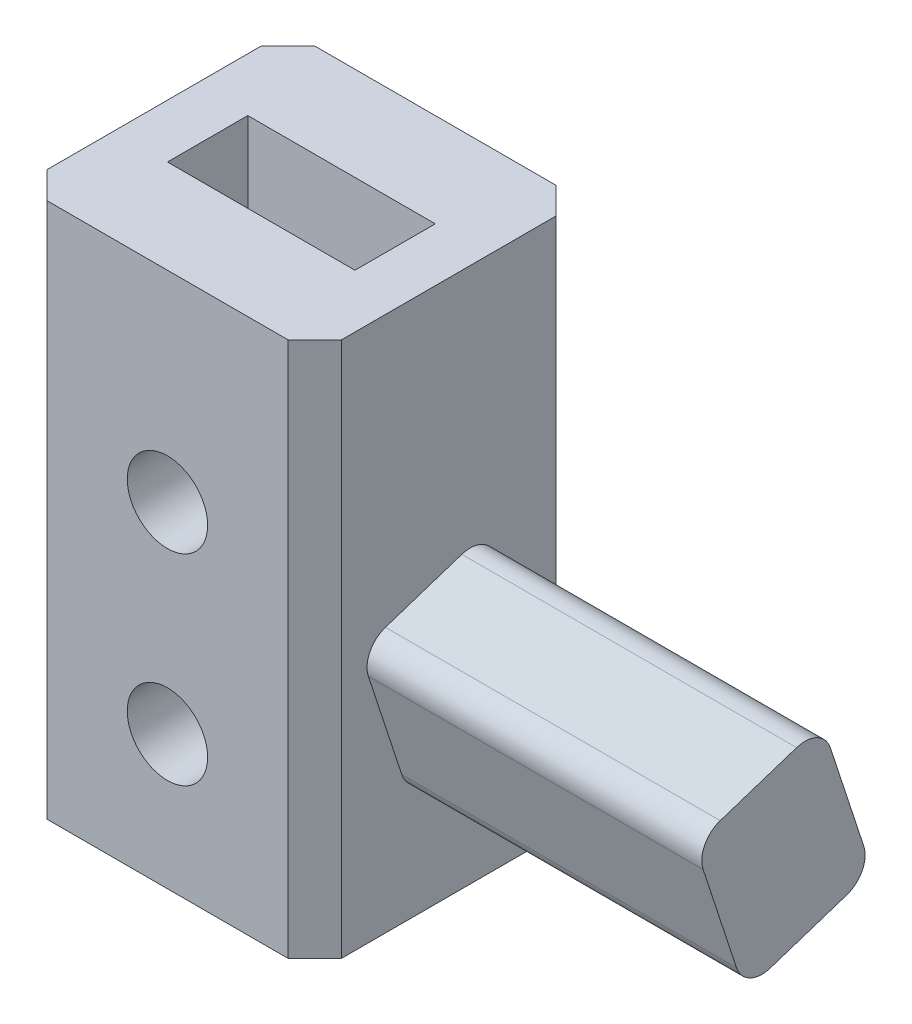
ISO-10303-21;
HEADER;
FILE_DESCRIPTION(('STEP AP214'),'2;1');
FILE_NAME('part.step','',(''),(''),'','','');
FILE_SCHEMA(('AUTOMOTIVE_DESIGN { 1 0 10303 214 1 1 1 1 }'));
ENDSEC;
DATA;
#1=APPLICATION_CONTEXT('core data for automotive mechanical design processes');
#2=APPLICATION_PROTOCOL_DEFINITION('international standard','automotive_design',2000,#1);
#3=PRODUCT_CONTEXT('',#1,'mechanical');
#4=PRODUCT('Part','Part','',(#3));
#5=PRODUCT_RELATED_PRODUCT_CATEGORY('part','',(#4));
#6=PRODUCT_DEFINITION_FORMATION('','',#4);
#7=PRODUCT_DEFINITION_CONTEXT('part definition',#1,'design');
#8=PRODUCT_DEFINITION('design','',#6,#7);
#9=PRODUCT_DEFINITION_SHAPE('','',#8);
#10=(LENGTH_UNIT() NAMED_UNIT(*) SI_UNIT(.MILLI.,.METRE.));
#11=(NAMED_UNIT(*) PLANE_ANGLE_UNIT() SI_UNIT($,.RADIAN.));
#12=(NAMED_UNIT(*) SI_UNIT($,.STERADIAN.) SOLID_ANGLE_UNIT());
#13=UNCERTAINTY_MEASURE_WITH_UNIT(LENGTH_MEASURE(1.E-05),#10,'distance_accuracy_value','');
#14=(GEOMETRIC_REPRESENTATION_CONTEXT(3) GLOBAL_UNCERTAINTY_ASSIGNED_CONTEXT((#13)) GLOBAL_UNIT_ASSIGNED_CONTEXT((#10,
#11,#12)) REPRESENTATION_CONTEXT('',''));
#15=CARTESIAN_POINT('',(0.,0.,0.));
#16=DIRECTION('',(0.,0.,1.));
#17=DIRECTION('',(1.,0.,0.));
#18=AXIS2_PLACEMENT_3D('',#15,#16,#17);
#19=CARTESIAN_POINT('',(11.,40.,7.99999999999999));
#20=DIRECTION('',(-1.,0.,0.));
#21=DIRECTION('',(0.,0.,1.));
#22=AXIS2_PLACEMENT_3D('',#19,#20,#21);
#23=PLANE('',#22);
#24=DIRECTION('',(0.,0.,-1.));
#25=VECTOR('',#24,1.);
#26=CARTESIAN_POINT('',(11.,0.,7.99999999999999));
#27=LINE('',#26,#25);
#28=CARTESIAN_POINT('',(11.,0.,7.99999999999999));
#29=VERTEX_POINT('',#28);
#30=CARTESIAN_POINT('',(11.,0.,-8.00000000000001));
#31=VERTEX_POINT('',#30);
#32=EDGE_CURVE('E255',#29,#31,#27,.T.);
#33=ORIENTED_EDGE('',*,*,#32,.T.);
#34=DIRECTION('',(0.,-1.,0.));
#35=VECTOR('',#34,1.);
#36=CARTESIAN_POINT('',(11.,40.,-8.00000000000001));
#37=LINE('',#36,#35);
#38=CARTESIAN_POINT('',(11.,40.,-8.00000000000001));
#39=VERTEX_POINT('',#38);
#40=EDGE_CURVE('E270',#39,#31,#37,.T.);
#41=ORIENTED_EDGE('',*,*,#40,.F.);
#42=DIRECTION('',(0.,0.,-1.));
#43=VECTOR('',#42,1.);
#44=CARTESIAN_POINT('',(11.,40.,7.99999999999999));
#45=LINE('',#44,#43);
#46=CARTESIAN_POINT('',(11.,40.,7.99999999999999));
#47=VERTEX_POINT('',#46);
#48=EDGE_CURVE('E238',#47,#39,#45,.T.);
#49=ORIENTED_EDGE('',*,*,#48,.F.);
#50=DIRECTION('',(0.,-1.,0.));
#51=VECTOR('',#50,1.);
#52=CARTESIAN_POINT('',(11.,40.,7.99999999999999));
#53=LINE('',#52,#51);
#54=EDGE_CURVE('E273',#47,#29,#53,.T.);
#55=ORIENTED_EDGE('',*,*,#54,.T.);
#56=EDGE_LOOP('',(#33,#41,#49,#55));
#57=FACE_BOUND('',#56,.T.);
#58=CARTESIAN_POINT('',(11.,17.8663977427574,4.0967992360275));
#59=DIRECTION('',(1.,0.,0.));
#60=DIRECTION('',(0.,0.,-1.));
#61=AXIS2_PLACEMENT_3D('',#58,#59,#60);
#62=CIRCLE('',#61,2.);
#63=CARTESIAN_POINT('',(11.,19.7668768370863,4.71983953329452));
#64=VERTEX_POINT('',#63);
#65=CARTESIAN_POINT('',(11.,17.2433574454903,5.99727833035645));
#66=VERTEX_POINT('',#65);
#67=EDGE_CURVE('E190',#64,#66,#62,.T.);
#68=ORIENTED_EDGE('',*,*,#67,.F.);
#69=DIRECTION('',(0.,-0.311520148633516,0.950239547164478));
#70=VECTOR('',#69,1.);
#71=CARTESIAN_POINT('',(11.,19.7668768370863,4.71983953329452));
#72=LINE('',#71,#70);
#73=CARTESIAN_POINT('',(11.,21.6359977288874,-0.981597749692318));
#74=VERTEX_POINT('',#73);
#75=EDGE_CURVE('E187',#74,#64,#72,.T.);
#76=ORIENTED_EDGE('',*,*,#75,.F.);
#77=CARTESIAN_POINT('',(11.,19.7355186345585,-1.60463804695936));
#78=DIRECTION('',(1.,0.,0.));
#79=DIRECTION('',(0.,0.,-1.));
#80=AXIS2_PLACEMENT_3D('',#77,#78,#79);
#81=CIRCLE('',#80,2.);
#82=CARTESIAN_POINT('',(11.,20.3585589318255,-3.50511714128832));
#83=VERTEX_POINT('',#82);
#84=EDGE_CURVE('E449',#83,#74,#81,.T.);
#85=ORIENTED_EDGE('',*,*,#84,.F.);
#86=DIRECTION('',(0.,0.950239547164478,0.311520148633517));
#87=VECTOR('',#86,1.);
#88=CARTESIAN_POINT('',(11.,12.7566425545097,-5.99727833035645));
#89=LINE('',#88,#87);
#90=CARTESIAN_POINT('',(11.,12.7566425545097,-5.99727833035646));
#91=VERTEX_POINT('',#90);
#92=EDGE_CURVE('E446',#91,#83,#89,.T.);
#93=ORIENTED_EDGE('',*,*,#92,.F.);
#94=CARTESIAN_POINT('',(11.,12.1336022572426,-4.0967992360275));
#95=DIRECTION('',(1.,0.,0.));
#96=DIRECTION('',(0.,0.,-1.));
#97=AXIS2_PLACEMENT_3D('',#94,#95,#96);
#98=CIRCLE('',#97,2.);
#99=CARTESIAN_POINT('',(11.,10.2331231629137,-4.71983953329452));
#100=VERTEX_POINT('',#99);
#101=EDGE_CURVE('E443',#100,#91,#98,.T.);
#102=ORIENTED_EDGE('',*,*,#101,.F.);
#103=DIRECTION('',(0.,0.311520148633517,-0.950239547164478));
#104=VECTOR('',#103,1.);
#105=CARTESIAN_POINT('',(11.,8.36400227111258,0.98159774969232));
#106=LINE('',#105,#104);
#107=CARTESIAN_POINT('',(11.,8.36400227111259,0.98159774969232));
#108=VERTEX_POINT('',#107);
#109=EDGE_CURVE('E440',#108,#100,#106,.T.);
#110=ORIENTED_EDGE('',*,*,#109,.F.);
#111=CARTESIAN_POINT('',(11.,10.2644813654415,1.60463804695937));
#112=DIRECTION('',(1.,0.,0.));
#113=DIRECTION('',(0.,0.,-1.));
#114=AXIS2_PLACEMENT_3D('',#111,#112,#113);
#115=CIRCLE('',#114,2.);
#116=CARTESIAN_POINT('',(11.,9.64144106817451,3.50511714128833));
#117=VERTEX_POINT('',#116);
#118=EDGE_CURVE('E53',#117,#108,#115,.T.);
#119=ORIENTED_EDGE('',*,*,#118,.F.);
#120=DIRECTION('',(0.,-0.950239547164478,-0.311520148633517));
#121=VECTOR('',#120,1.);
#122=CARTESIAN_POINT('',(11.,9.64144106817451,3.50511714128833));
#123=LINE('',#122,#121);
#124=EDGE_CURVE('E48',#66,#117,#123,.T.);
#125=ORIENTED_EDGE('',*,*,#124,.F.);
#126=EDGE_LOOP('',(#68,#76,#85,#93,#102,#110,#119,#125));
#127=FACE_BOUND('',#126,.T.);
#128=ADVANCED_FACE('F33',(#57,#127),#23,.F.);
#129=CARTESIAN_POINT('',(0.,40.,0.));
#130=DIRECTION('',(0.,1.,0.));
#131=DIRECTION('',(0.,0.,1.));
#132=AXIS2_PLACEMENT_3D('',#129,#130,#131);
#133=PLANE('',#132);
#134=DIRECTION('',(0.,0.,1.));
#135=VECTOR('',#134,1.);
#136=CARTESIAN_POINT('',(-11.,40.,8.));
#137=LINE('',#136,#135);
#138=CARTESIAN_POINT('',(-11.,40.,-8.));
#139=VERTEX_POINT('',#138);
#140=CARTESIAN_POINT('',(-11.,40.,8.));
#141=VERTEX_POINT('',#140);
#142=EDGE_CURVE('E228',#139,#141,#137,.T.);
#143=ORIENTED_EDGE('',*,*,#142,.T.);
#144=DIRECTION('',(0.707106781186548,0.,0.707106781186548));
#145=VECTOR('',#144,1.);
#146=CARTESIAN_POINT('',(-9.,40.,10.));
#147=LINE('',#146,#145);
#148=CARTESIAN_POINT('',(-9.,40.,10.));
#149=VERTEX_POINT('',#148);
#150=EDGE_CURVE('E231',#141,#149,#147,.T.);
#151=ORIENTED_EDGE('',*,*,#150,.T.);
#152=DIRECTION('',(1.,0.,0.));
#153=VECTOR('',#152,1.);
#154=CARTESIAN_POINT('',(9.,40.,9.99999999999999));
#155=LINE('',#154,#153);
#156=CARTESIAN_POINT('',(9.,40.,9.99999999999999));
#157=VERTEX_POINT('',#156);
#158=EDGE_CURVE('E234',#149,#157,#155,.T.);
#159=ORIENTED_EDGE('',*,*,#158,.T.);
#160=DIRECTION('',(0.707106781186548,0.,-0.707106781186548));
#161=VECTOR('',#160,1.);
#162=CARTESIAN_POINT('',(11.,40.,7.99999999999999));
#163=LINE('',#162,#161);
#164=EDGE_CURVE('E236',#157,#47,#163,.T.);
#165=ORIENTED_EDGE('',*,*,#164,.T.);
#166=ORIENTED_EDGE('',*,*,#48,.T.);
#167=DIRECTION('',(-0.707106781186548,0.,-0.707106781186548));
#168=VECTOR('',#167,1.);
#169=CARTESIAN_POINT('',(11.,40.,-8.00000000000001));
#170=LINE('',#169,#168);
#171=CARTESIAN_POINT('',(9.,40.,-10.));
#172=VERTEX_POINT('',#171);
#173=EDGE_CURVE('E240',#39,#172,#170,.T.);
#174=ORIENTED_EDGE('',*,*,#173,.T.);
#175=DIRECTION('',(-1.,0.,0.));
#176=VECTOR('',#175,1.);
#177=CARTESIAN_POINT('',(9.,40.,-10.));
#178=LINE('',#177,#176);
#179=CARTESIAN_POINT('',(-9.,40.,-10.));
#180=VERTEX_POINT('',#179);
#181=EDGE_CURVE('E242',#172,#180,#178,.T.);
#182=ORIENTED_EDGE('',*,*,#181,.T.);
#183=DIRECTION('',(-0.707106781186548,0.,0.707106781186548));
#184=VECTOR('',#183,1.);
#185=CARTESIAN_POINT('',(-11.,40.,-8.));
#186=LINE('',#185,#184);
#187=EDGE_CURVE('E244',#180,#139,#186,.T.);
#188=ORIENTED_EDGE('',*,*,#187,.T.);
#189=EDGE_LOOP('',(#143,#151,#159,#165,#166,#174,#182,#188));
#190=FACE_BOUND('',#189,.T.);
#191=DIRECTION('',(1.,0.,0.));
#192=VECTOR('',#191,1.);
#193=CARTESIAN_POINT('',(7.,40.,3.));
#194=LINE('',#193,#192);
#195=CARTESIAN_POINT('',(-7.,40.,3.));
#196=VERTEX_POINT('',#195);
#197=CARTESIAN_POINT('',(7.,40.,3.));
#198=VERTEX_POINT('',#197);
#199=EDGE_CURVE('E202',#196,#198,#194,.T.);
#200=ORIENTED_EDGE('',*,*,#199,.F.);
#201=DIRECTION('',(0.,0.,1.));
#202=VECTOR('',#201,1.);
#203=CARTESIAN_POINT('',(-7.,40.,3.));
#204=LINE('',#203,#202);
#205=CARTESIAN_POINT('',(-7.,40.,-3.));
#206=VERTEX_POINT('',#205);
#207=EDGE_CURVE('E200',#206,#196,#204,.T.);
#208=ORIENTED_EDGE('',*,*,#207,.F.);
#209=DIRECTION('',(-1.,0.,0.));
#210=VECTOR('',#209,1.);
#211=CARTESIAN_POINT('',(7.,40.,-3.));
#212=LINE('',#211,#210);
#213=CARTESIAN_POINT('',(7.,40.,-3.));
#214=VERTEX_POINT('',#213);
#215=EDGE_CURVE('E208',#214,#206,#212,.T.);
#216=ORIENTED_EDGE('',*,*,#215,.F.);
#217=DIRECTION('',(0.,0.,-1.));
#218=VECTOR('',#217,1.);
#219=CARTESIAN_POINT('',(7.,40.,3.));
#220=LINE('',#219,#218);
#221=EDGE_CURVE('E205',#198,#214,#220,.T.);
#222=ORIENTED_EDGE('',*,*,#221,.F.);
#223=EDGE_LOOP('',(#200,#208,#216,#222));
#224=FACE_BOUND('',#223,.T.);
#225=ADVANCED_FACE('F302',(#190,#224),#133,.T.);
#226=CARTESIAN_POINT('',(0.,0.,0.));
#227=DIRECTION('',(0.,1.,0.));
#228=DIRECTION('',(0.,0.,1.));
#229=AXIS2_PLACEMENT_3D('',#226,#227,#228);
#230=PLANE('',#229);
#231=DIRECTION('',(0.,0.,1.));
#232=VECTOR('',#231,1.);
#233=CARTESIAN_POINT('',(-11.,0.,8.));
#234=LINE('',#233,#232);
#235=CARTESIAN_POINT('',(-11.,0.,-8.));
#236=VERTEX_POINT('',#235);
#237=CARTESIAN_POINT('',(-11.,0.,8.));
#238=VERTEX_POINT('',#237);
#239=EDGE_CURVE('E227',#236,#238,#234,.T.);
#240=ORIENTED_EDGE('',*,*,#239,.F.);
#241=DIRECTION('',(-0.707106781186548,0.,0.707106781186548));
#242=VECTOR('',#241,1.);
#243=CARTESIAN_POINT('',(-11.,0.,-8.));
#244=LINE('',#243,#242);
#245=CARTESIAN_POINT('',(-9.,0.,-10.));
#246=VERTEX_POINT('',#245);
#247=EDGE_CURVE('E232',#246,#236,#244,.T.);
#248=ORIENTED_EDGE('',*,*,#247,.F.);
#249=DIRECTION('',(-1.,0.,0.));
#250=VECTOR('',#249,1.);
#251=CARTESIAN_POINT('',(9.,0.,-10.));
#252=LINE('',#251,#250);
#253=CARTESIAN_POINT('',(9.,0.,-10.));
#254=VERTEX_POINT('',#253);
#255=EDGE_CURVE('E259',#254,#246,#252,.T.);
#256=ORIENTED_EDGE('',*,*,#255,.F.);
#257=DIRECTION('',(-0.707106781186548,0.,-0.707106781186548));
#258=VECTOR('',#257,1.);
#259=CARTESIAN_POINT('',(11.,0.,-8.00000000000001));
#260=LINE('',#259,#258);
#261=EDGE_CURVE('E257',#31,#254,#260,.T.);
#262=ORIENTED_EDGE('',*,*,#261,.F.);
#263=ORIENTED_EDGE('',*,*,#32,.F.);
#264=DIRECTION('',(0.707106781186548,0.,-0.707106781186548));
#265=VECTOR('',#264,1.);
#266=CARTESIAN_POINT('',(11.,0.,7.99999999999999));
#267=LINE('',#266,#265);
#268=CARTESIAN_POINT('',(9.,0.,9.99999999999999));
#269=VERTEX_POINT('',#268);
#270=EDGE_CURVE('E253',#269,#29,#267,.T.);
#271=ORIENTED_EDGE('',*,*,#270,.F.);
#272=DIRECTION('',(1.,0.,0.));
#273=VECTOR('',#272,1.);
#274=CARTESIAN_POINT('',(9.,0.,9.99999999999999));
#275=LINE('',#274,#273);
#276=CARTESIAN_POINT('',(-9.,0.,10.));
#277=VERTEX_POINT('',#276);
#278=EDGE_CURVE('E251',#277,#269,#275,.T.);
#279=ORIENTED_EDGE('',*,*,#278,.F.);
#280=DIRECTION('',(0.707106781186548,0.,0.707106781186548));
#281=VECTOR('',#280,1.);
#282=CARTESIAN_POINT('',(-9.,0.,10.));
#283=LINE('',#282,#281);
#284=EDGE_CURVE('E249',#238,#277,#283,.T.);
#285=ORIENTED_EDGE('',*,*,#284,.F.);
#286=EDGE_LOOP('',(#240,#248,#256,#262,#263,#271,#279,#285));
#287=FACE_BOUND('',#286,.T.);
#288=DIRECTION('',(0.,0.,1.));
#289=VECTOR('',#288,1.);
#290=CARTESIAN_POINT('',(-7.,0.,3.));
#291=LINE('',#290,#289);
#292=CARTESIAN_POINT('',(-7.,0.,-3.));
#293=VERTEX_POINT('',#292);
#294=CARTESIAN_POINT('',(-7.,0.,3.));
#295=VERTEX_POINT('',#294);
#296=EDGE_CURVE('E191',#293,#295,#291,.T.);
#297=ORIENTED_EDGE('',*,*,#296,.T.);
#298=DIRECTION('',(1.,0.,0.));
#299=VECTOR('',#298,1.);
#300=CARTESIAN_POINT('',(7.,0.,3.));
#301=LINE('',#300,#299);
#302=CARTESIAN_POINT('',(7.,0.,3.));
#303=VERTEX_POINT('',#302);
#304=EDGE_CURVE('E194',#295,#303,#301,.T.);
#305=ORIENTED_EDGE('',*,*,#304,.T.);
#306=DIRECTION('',(0.,0.,-1.));
#307=VECTOR('',#306,1.);
#308=CARTESIAN_POINT('',(7.,0.,3.));
#309=LINE('',#308,#307);
#310=CARTESIAN_POINT('',(7.,0.,-3.));
#311=VERTEX_POINT('',#310);
#312=EDGE_CURVE('E213',#303,#311,#309,.T.);
#313=ORIENTED_EDGE('',*,*,#312,.T.);
#314=DIRECTION('',(-1.,0.,0.));
#315=VECTOR('',#314,1.);
#316=CARTESIAN_POINT('',(7.,0.,-3.));
#317=LINE('',#316,#315);
#318=EDGE_CURVE('E203',#311,#293,#317,.T.);
#319=ORIENTED_EDGE('',*,*,#318,.T.);
#320=EDGE_LOOP('',(#297,#305,#313,#319));
#321=FACE_BOUND('',#320,.T.);
#322=ADVANCED_FACE('F289',(#287,#321),#230,.F.);
#323=CARTESIAN_POINT('',(-11.,40.,8.));
#324=DIRECTION('',(1.,0.,0.));
#325=DIRECTION('',(0.,0.,-1.));
#326=AXIS2_PLACEMENT_3D('',#323,#324,#325);
#327=PLANE('',#326);
#328=ORIENTED_EDGE('',*,*,#239,.T.);
#329=DIRECTION('',(0.,-1.,0.));
#330=VECTOR('',#329,1.);
#331=CARTESIAN_POINT('',(-11.,40.,8.));
#332=LINE('',#331,#330);
#333=EDGE_CURVE('E11',#141,#238,#332,.T.);
#334=ORIENTED_EDGE('',*,*,#333,.F.);
#335=ORIENTED_EDGE('',*,*,#142,.F.);
#336=DIRECTION('',(0.,-1.,0.));
#337=VECTOR('',#336,1.);
#338=CARTESIAN_POINT('',(-11.,40.,-8.));
#339=LINE('',#338,#337);
#340=EDGE_CURVE('E246',#139,#236,#339,.T.);
#341=ORIENTED_EDGE('',*,*,#340,.T.);
#342=EDGE_LOOP('',(#328,#334,#335,#341));
#343=FACE_BOUND('',#342,.T.);
#344=ADVANCED_FACE('F35',(#343),#327,.F.);
#345=CARTESIAN_POINT('',(-9.,40.,10.));
#346=DIRECTION('',(0.707106781186548,0.,-0.707106781186548));
#347=DIRECTION('',(-0.707106781186548,0.,-0.707106781186548));
#348=AXIS2_PLACEMENT_3D('',#345,#346,#347);
#349=PLANE('',#348);
#350=ORIENTED_EDGE('',*,*,#284,.T.);
#351=DIRECTION('',(0.,-1.,0.));
#352=VECTOR('',#351,1.);
#353=CARTESIAN_POINT('',(-9.,40.,10.));
#354=LINE('',#353,#352);
#355=EDGE_CURVE('E41',#149,#277,#354,.T.);
#356=ORIENTED_EDGE('',*,*,#355,.F.);
#357=ORIENTED_EDGE('',*,*,#150,.F.);
#358=ORIENTED_EDGE('',*,*,#333,.T.);
#359=EDGE_LOOP('',(#350,#356,#357,#358));
#360=FACE_BOUND('',#359,.T.);
#361=ADVANCED_FACE('F307',(#360),#349,.F.);
#362=CARTESIAN_POINT('',(9.,40.,9.99999999999999));
#363=DIRECTION('',(0.,0.,-1.));
#364=DIRECTION('',(-1.,0.,0.));
#365=AXIS2_PLACEMENT_3D('',#362,#363,#364);
#366=PLANE('',#365);
#367=CARTESIAN_POINT('',(0.,25.,10.));
#368=DIRECTION('',(0.,0.,1.));
#369=DIRECTION('',(1.,0.,0.));
#370=AXIS2_PLACEMENT_3D('',#367,#368,#369);
#371=CIRCLE('',#370,3.);
#372=CARTESIAN_POINT('',(3.,25.,10.));
#373=VERTEX_POINT('',#372);
#374=EDGE_CURVE('E416',#373,#373,#371,.T.);
#375=ORIENTED_EDGE('',*,*,#374,.F.);
#376=EDGE_LOOP('',(#375));
#377=FACE_BOUND('',#376,.T.);
#378=CARTESIAN_POINT('',(0.,10.,10.));
#379=DIRECTION('',(0.,0.,1.));
#380=DIRECTION('',(1.,0.,0.));
#381=AXIS2_PLACEMENT_3D('',#378,#379,#380);
#382=CIRCLE('',#381,3.);
#383=CARTESIAN_POINT('',(3.,10.,10.));
#384=VERTEX_POINT('',#383);
#385=EDGE_CURVE('E420',#384,#384,#382,.T.);
#386=ORIENTED_EDGE('',*,*,#385,.F.);
#387=EDGE_LOOP('',(#386));
#388=FACE_BOUND('',#387,.T.);
#389=ORIENTED_EDGE('',*,*,#278,.T.);
#390=DIRECTION('',(0.,-1.,0.));
#391=VECTOR('',#390,1.);
#392=CARTESIAN_POINT('',(9.,40.,9.99999999999999));
#393=LINE('',#392,#391);
#394=EDGE_CURVE('E276',#157,#269,#393,.T.);
#395=ORIENTED_EDGE('',*,*,#394,.F.);
#396=ORIENTED_EDGE('',*,*,#158,.F.);
#397=ORIENTED_EDGE('',*,*,#355,.T.);
#398=EDGE_LOOP('',(#389,#395,#396,#397));
#399=FACE_BOUND('',#398,.T.);
#400=ADVANCED_FACE('F283',(#377,#388,#399),#366,.F.);
#401=CARTESIAN_POINT('',(11.,40.,7.99999999999999));
#402=DIRECTION('',(-0.707106781186548,0.,-0.707106781186548));
#403=DIRECTION('',(-0.707106781186548,0.,0.707106781186548));
#404=AXIS2_PLACEMENT_3D('',#401,#402,#403);
#405=PLANE('',#404);
#406=ORIENTED_EDGE('',*,*,#270,.T.);
#407=ORIENTED_EDGE('',*,*,#54,.F.);
#408=ORIENTED_EDGE('',*,*,#164,.F.);
#409=ORIENTED_EDGE('',*,*,#394,.T.);
#410=EDGE_LOOP('',(#406,#407,#408,#409));
#411=FACE_BOUND('',#410,.T.);
#412=ADVANCED_FACE('F295',(#411),#405,.F.);
#413=CARTESIAN_POINT('',(11.,40.,-8.00000000000001));
#414=DIRECTION('',(-0.707106781186548,0.,0.707106781186548));
#415=DIRECTION('',(0.707106781186548,0.,0.707106781186548));
#416=AXIS2_PLACEMENT_3D('',#413,#414,#415);
#417=PLANE('',#416);
#418=ORIENTED_EDGE('',*,*,#261,.T.);
#419=DIRECTION('',(0.,-1.,0.));
#420=VECTOR('',#419,1.);
#421=CARTESIAN_POINT('',(9.,40.,-10.));
#422=LINE('',#421,#420);
#423=EDGE_CURVE('E267',#172,#254,#422,.T.);
#424=ORIENTED_EDGE('',*,*,#423,.F.);
#425=ORIENTED_EDGE('',*,*,#173,.F.);
#426=ORIENTED_EDGE('',*,*,#40,.T.);
#427=EDGE_LOOP('',(#418,#424,#425,#426));
#428=FACE_BOUND('',#427,.T.);
#429=ADVANCED_FACE('F320',(#428),#417,.F.);
#430=CARTESIAN_POINT('',(9.,40.,-10.));
#431=DIRECTION('',(0.,0.,1.));
#432=DIRECTION('',(1.,0.,0.));
#433=AXIS2_PLACEMENT_3D('',#430,#431,#432);
#434=PLANE('',#433);
#435=ORIENTED_EDGE('',*,*,#255,.T.);
#436=DIRECTION('',(0.,-1.,0.));
#437=VECTOR('',#436,1.);
#438=CARTESIAN_POINT('',(-9.,40.,-10.));
#439=LINE('',#438,#437);
#440=EDGE_CURVE('E264',#180,#246,#439,.T.);
#441=ORIENTED_EDGE('',*,*,#440,.F.);
#442=ORIENTED_EDGE('',*,*,#181,.F.);
#443=ORIENTED_EDGE('',*,*,#423,.T.);
#444=EDGE_LOOP('',(#435,#441,#442,#443));
#445=FACE_BOUND('',#444,.T.);
#446=ADVANCED_FACE('F318',(#445),#434,.F.);
#447=CARTESIAN_POINT('',(-11.,40.,-8.));
#448=DIRECTION('',(0.707106781186548,0.,0.707106781186548));
#449=DIRECTION('',(0.707106781186548,0.,-0.707106781186548));
#450=AXIS2_PLACEMENT_3D('',#447,#448,#449);
#451=PLANE('',#450);
#452=ORIENTED_EDGE('',*,*,#247,.T.);
#453=ORIENTED_EDGE('',*,*,#340,.F.);
#454=ORIENTED_EDGE('',*,*,#187,.F.);
#455=ORIENTED_EDGE('',*,*,#440,.T.);
#456=EDGE_LOOP('',(#452,#453,#454,#455));
#457=FACE_BOUND('',#456,.T.);
#458=ADVANCED_FACE('F313',(#457),#451,.F.);
#459=CARTESIAN_POINT('',(-7.,40.,3.));
#460=DIRECTION('',(1.,0.,0.));
#461=DIRECTION('',(0.,0.,-1.));
#462=AXIS2_PLACEMENT_3D('',#459,#460,#461);
#463=PLANE('',#462);
#464=ORIENTED_EDGE('',*,*,#296,.F.);
#465=DIRECTION('',(0.,-1.,0.));
#466=VECTOR('',#465,1.);
#467=CARTESIAN_POINT('',(-7.,40.,-3.));
#468=LINE('',#467,#466);
#469=EDGE_CURVE('E209',#206,#293,#468,.T.);
#470=ORIENTED_EDGE('',*,*,#469,.F.);
#471=ORIENTED_EDGE('',*,*,#207,.T.);
#472=DIRECTION('',(0.,-1.,0.));
#473=VECTOR('',#472,1.);
#474=CARTESIAN_POINT('',(-7.,40.,3.));
#475=LINE('',#474,#473);
#476=EDGE_CURVE('E224',#196,#295,#475,.T.);
#477=ORIENTED_EDGE('',*,*,#476,.T.);
#478=EDGE_LOOP('',(#464,#470,#471,#477));
#479=FACE_BOUND('',#478,.T.);
#480=ADVANCED_FACE('F351',(#479),#463,.T.);
#481=CARTESIAN_POINT('',(7.,40.,3.));
#482=DIRECTION('',(0.,0.,-1.));
#483=DIRECTION('',(-1.,0.,0.));
#484=AXIS2_PLACEMENT_3D('',#481,#482,#483);
#485=PLANE('',#484);
#486=CARTESIAN_POINT('',(0.,25.,3.));
#487=DIRECTION('',(0.,0.,-1.));
#488=DIRECTION('',(-1.,0.,0.));
#489=AXIS2_PLACEMENT_3D('',#486,#487,#488);
#490=CIRCLE('',#489,3.);
#491=CARTESIAN_POINT('',(-3.,25.,3.));
#492=VERTEX_POINT('',#491);
#493=EDGE_CURVE('E413',#492,#492,#490,.F.);
#494=ORIENTED_EDGE('',*,*,#493,.T.);
#495=EDGE_LOOP('',(#494));
#496=FACE_BOUND('',#495,.T.);
#497=CARTESIAN_POINT('',(0.,10.,3.));
#498=DIRECTION('',(0.,0.,-1.));
#499=DIRECTION('',(-1.,0.,0.));
#500=AXIS2_PLACEMENT_3D('',#497,#498,#499);
#501=CIRCLE('',#500,3.);
#502=CARTESIAN_POINT('',(-3.,10.,3.));
#503=VERTEX_POINT('',#502);
#504=EDGE_CURVE('E417',#503,#503,#501,.F.);
#505=ORIENTED_EDGE('',*,*,#504,.T.);
#506=EDGE_LOOP('',(#505));
#507=FACE_BOUND('',#506,.T.);
#508=ORIENTED_EDGE('',*,*,#304,.F.);
#509=ORIENTED_EDGE('',*,*,#476,.F.);
#510=ORIENTED_EDGE('',*,*,#199,.T.);
#511=DIRECTION('',(0.,-1.,0.));
#512=VECTOR('',#511,1.);
#513=CARTESIAN_POINT('',(7.,40.,3.));
#514=LINE('',#513,#512);
#515=EDGE_CURVE('E222',#198,#303,#514,.T.);
#516=ORIENTED_EDGE('',*,*,#515,.T.);
#517=EDGE_LOOP('',(#508,#509,#510,#516));
#518=FACE_BOUND('',#517,.T.);
#519=ADVANCED_FACE('F355',(#496,#507,#518),#485,.T.);
#520=CARTESIAN_POINT('',(7.,40.,3.));
#521=DIRECTION('',(-1.,0.,0.));
#522=DIRECTION('',(0.,0.,1.));
#523=AXIS2_PLACEMENT_3D('',#520,#521,#522);
#524=PLANE('',#523);
#525=ORIENTED_EDGE('',*,*,#312,.F.);
#526=ORIENTED_EDGE('',*,*,#515,.F.);
#527=ORIENTED_EDGE('',*,*,#221,.T.);
#528=DIRECTION('',(0.,-1.,0.));
#529=VECTOR('',#528,1.);
#530=CARTESIAN_POINT('',(7.,40.,-3.));
#531=LINE('',#530,#529);
#532=EDGE_CURVE('E220',#214,#311,#531,.T.);
#533=ORIENTED_EDGE('',*,*,#532,.T.);
#534=EDGE_LOOP('',(#525,#526,#527,#533));
#535=FACE_BOUND('',#534,.T.);
#536=ADVANCED_FACE('F360',(#535),#524,.T.);
#537=CARTESIAN_POINT('',(7.,40.,-3.));
#538=DIRECTION('',(0.,0.,1.));
#539=DIRECTION('',(1.,0.,0.));
#540=AXIS2_PLACEMENT_3D('',#537,#538,#539);
#541=PLANE('',#540);
#542=ORIENTED_EDGE('',*,*,#318,.F.);
#543=ORIENTED_EDGE('',*,*,#532,.F.);
#544=ORIENTED_EDGE('',*,*,#215,.T.);
#545=ORIENTED_EDGE('',*,*,#469,.T.);
#546=EDGE_LOOP('',(#542,#543,#544,#545));
#547=FACE_BOUND('',#546,.T.);
#548=ADVANCED_FACE('F366',(#547),#541,.T.);
#549=CARTESIAN_POINT('',(36.,17.8663977427574,4.0967992360275));
#550=DIRECTION('',(-1.,0.,0.));
#551=DIRECTION('',(0.,0.,1.));
#552=AXIS2_PLACEMENT_3D('',#549,#550,#551);
#553=CYLINDRICAL_SURFACE('',#552,2.);
#554=ORIENTED_EDGE('',*,*,#67,.T.);
#555=DIRECTION('',(-1.,0.,0.));
#556=VECTOR('',#555,1.);
#557=CARTESIAN_POINT('',(36.,17.2433574454903,5.99727833035645));
#558=LINE('',#557,#556);
#559=CARTESIAN_POINT('',(36.,17.2433574454903,5.99727833035645));
#560=VERTEX_POINT('',#559);
#561=EDGE_CURVE('E171',#560,#66,#558,.T.);
#562=ORIENTED_EDGE('',*,*,#561,.F.);
#563=CARTESIAN_POINT('',(36.,17.8663977427574,4.0967992360275));
#564=DIRECTION('',(1.,0.,0.));
#565=DIRECTION('',(0.,0.,-1.));
#566=AXIS2_PLACEMENT_3D('',#563,#564,#565);
#567=CIRCLE('',#566,2.);
#568=CARTESIAN_POINT('',(36.,19.7668768370863,4.71983953329452));
#569=VERTEX_POINT('',#568);
#570=EDGE_CURVE('E178',#569,#560,#567,.T.);
#571=ORIENTED_EDGE('',*,*,#570,.F.);
#572=DIRECTION('',(-1.,0.,0.));
#573=VECTOR('',#572,1.);
#574=CARTESIAN_POINT('',(36.,19.7668768370863,4.71983953329452));
#575=LINE('',#574,#573);
#576=EDGE_CURVE('E436',#569,#64,#575,.T.);
#577=ORIENTED_EDGE('',*,*,#576,.T.);
#578=EDGE_LOOP('',(#554,#562,#571,#577));
#579=FACE_BOUND('',#578,.T.);
#580=ADVANCED_FACE('F189',(#579),#553,.T.);
#581=CARTESIAN_POINT('',(36.,9.64144106817451,3.50511714128833));
#582=DIRECTION('',(0.,0.311520148633517,-0.950239547164478));
#583=DIRECTION('',(0.,0.950239547164478,0.311520148633517));
#584=AXIS2_PLACEMENT_3D('',#581,#582,#583);
#585=PLANE('',#584);
#586=ORIENTED_EDGE('',*,*,#124,.T.);
#587=DIRECTION('',(-1.,0.,0.));
#588=VECTOR('',#587,1.);
#589=CARTESIAN_POINT('',(36.,9.64144106817451,3.50511714128833));
#590=LINE('',#589,#588);
#591=CARTESIAN_POINT('',(36.,9.64144106817451,3.50511714128833));
#592=VERTEX_POINT('',#591);
#593=EDGE_CURVE('E174',#592,#117,#590,.T.);
#594=ORIENTED_EDGE('',*,*,#593,.F.);
#595=DIRECTION('',(0.,-0.950239547164478,-0.311520148633517));
#596=VECTOR('',#595,1.);
#597=CARTESIAN_POINT('',(36.,9.64144106817451,3.50511714128833));
#598=LINE('',#597,#596);
#599=EDGE_CURVE('E167',#560,#592,#598,.T.);
#600=ORIENTED_EDGE('',*,*,#599,.F.);
#601=ORIENTED_EDGE('',*,*,#561,.T.);
#602=EDGE_LOOP('',(#586,#594,#600,#601));
#603=FACE_BOUND('',#602,.T.);
#604=ADVANCED_FACE('F169',(#603),#585,.F.);
#605=CARTESIAN_POINT('',(36.,10.2644813654415,1.60463804695937));
#606=DIRECTION('',(-1.,0.,0.));
#607=DIRECTION('',(0.,0.,1.));
#608=AXIS2_PLACEMENT_3D('',#605,#606,#607);
#609=CYLINDRICAL_SURFACE('',#608,2.);
#610=ORIENTED_EDGE('',*,*,#118,.T.);
#611=DIRECTION('',(-1.,0.,0.));
#612=VECTOR('',#611,1.);
#613=CARTESIAN_POINT('',(36.,8.36400227111258,0.98159774969232));
#614=LINE('',#613,#612);
#615=CARTESIAN_POINT('',(36.,8.36400227111258,0.98159774969232));
#616=VERTEX_POINT('',#615);
#617=EDGE_CURVE('E196',#616,#108,#614,.T.);
#618=ORIENTED_EDGE('',*,*,#617,.F.);
#619=CARTESIAN_POINT('',(36.,10.2644813654415,1.60463804695937));
#620=DIRECTION('',(1.,0.,0.));
#621=DIRECTION('',(0.,0.,-1.));
#622=AXIS2_PLACEMENT_3D('',#619,#620,#621);
#623=CIRCLE('',#622,2.);
#624=EDGE_CURVE('E177',#592,#616,#623,.T.);
#625=ORIENTED_EDGE('',*,*,#624,.F.);
#626=ORIENTED_EDGE('',*,*,#593,.T.);
#627=EDGE_LOOP('',(#610,#618,#625,#626));
#628=FACE_BOUND('',#627,.T.);
#629=ADVANCED_FACE('F375',(#628),#609,.T.);
#630=CARTESIAN_POINT('',(36.,8.36400227111258,0.98159774969232));
#631=DIRECTION('',(0.,0.950239547164478,0.311520148633517));
#632=DIRECTION('',(0.,-0.311520148633517,0.950239547164478));
#633=AXIS2_PLACEMENT_3D('',#630,#631,#632);
#634=PLANE('',#633);
#635=ORIENTED_EDGE('',*,*,#109,.T.);
#636=DIRECTION('',(-1.,0.,0.));
#637=VECTOR('',#636,1.);
#638=CARTESIAN_POINT('',(36.,10.2331231629137,-4.71983953329452));
#639=LINE('',#638,#637);
#640=CARTESIAN_POINT('',(36.,10.2331231629137,-4.71983953329452));
#641=VERTEX_POINT('',#640);
#642=EDGE_CURVE('E464',#641,#100,#639,.T.);
#643=ORIENTED_EDGE('',*,*,#642,.F.);
#644=DIRECTION('',(0.,0.311520148633517,-0.950239547164478));
#645=VECTOR('',#644,1.);
#646=CARTESIAN_POINT('',(36.,8.36400227111258,0.98159774969232));
#647=LINE('',#646,#645);
#648=EDGE_CURVE('E427',#616,#641,#647,.T.);
#649=ORIENTED_EDGE('',*,*,#648,.F.);
#650=ORIENTED_EDGE('',*,*,#617,.T.);
#651=EDGE_LOOP('',(#635,#643,#649,#650));
#652=FACE_BOUND('',#651,.T.);
#653=ADVANCED_FACE('F378',(#652),#634,.F.);
#654=CARTESIAN_POINT('',(36.,12.1336022572426,-4.0967992360275));
#655=DIRECTION('',(-1.,0.,0.));
#656=DIRECTION('',(0.,0.,1.));
#657=AXIS2_PLACEMENT_3D('',#654,#655,#656);
#658=CYLINDRICAL_SURFACE('',#657,2.);
#659=ORIENTED_EDGE('',*,*,#101,.T.);
#660=DIRECTION('',(-1.,0.,0.));
#661=VECTOR('',#660,1.);
#662=CARTESIAN_POINT('',(36.,12.7566425545097,-5.99727833035645));
#663=LINE('',#662,#661);
#664=CARTESIAN_POINT('',(36.,12.7566425545097,-5.99727833035645));
#665=VERTEX_POINT('',#664);
#666=EDGE_CURVE('E461',#665,#91,#663,.T.);
#667=ORIENTED_EDGE('',*,*,#666,.F.);
#668=CARTESIAN_POINT('',(36.,12.1336022572426,-4.0967992360275));
#669=DIRECTION('',(1.,0.,0.));
#670=DIRECTION('',(0.,0.,-1.));
#671=AXIS2_PLACEMENT_3D('',#668,#669,#670);
#672=CIRCLE('',#671,2.);
#673=EDGE_CURVE('E429',#641,#665,#672,.T.);
#674=ORIENTED_EDGE('',*,*,#673,.F.);
#675=ORIENTED_EDGE('',*,*,#642,.T.);
#676=EDGE_LOOP('',(#659,#667,#674,#675));
#677=FACE_BOUND('',#676,.T.);
#678=ADVANCED_FACE('F382',(#677),#658,.T.);
#679=CARTESIAN_POINT('',(36.,12.7566425545097,-5.99727833035645));
#680=DIRECTION('',(0.,-0.311520148633517,0.950239547164478));
#681=DIRECTION('',(0.,-0.950239547164478,-0.311520148633517));
#682=AXIS2_PLACEMENT_3D('',#679,#680,#681);
#683=PLANE('',#682);
#684=ORIENTED_EDGE('',*,*,#92,.T.);
#685=DIRECTION('',(-1.,0.,0.));
#686=VECTOR('',#685,1.);
#687=CARTESIAN_POINT('',(36.,20.3585589318255,-3.50511714128833));
#688=LINE('',#687,#686);
#689=CARTESIAN_POINT('',(36.,20.3585589318255,-3.50511714128833));
#690=VERTEX_POINT('',#689);
#691=EDGE_CURVE('E458',#690,#83,#688,.T.);
#692=ORIENTED_EDGE('',*,*,#691,.F.);
#693=DIRECTION('',(0.,0.950239547164478,0.311520148633517));
#694=VECTOR('',#693,1.);
#695=CARTESIAN_POINT('',(36.,12.7566425545097,-5.99727833035645));
#696=LINE('',#695,#694);
#697=EDGE_CURVE('E431',#665,#690,#696,.T.);
#698=ORIENTED_EDGE('',*,*,#697,.F.);
#699=ORIENTED_EDGE('',*,*,#666,.T.);
#700=EDGE_LOOP('',(#684,#692,#698,#699));
#701=FACE_BOUND('',#700,.T.);
#702=ADVANCED_FACE('F386',(#701),#683,.F.);
#703=CARTESIAN_POINT('',(36.,19.7355186345585,-1.60463804695936));
#704=DIRECTION('',(-1.,0.,0.));
#705=DIRECTION('',(0.,0.,1.));
#706=AXIS2_PLACEMENT_3D('',#703,#704,#705);
#707=CYLINDRICAL_SURFACE('',#706,2.);
#708=ORIENTED_EDGE('',*,*,#84,.T.);
#709=DIRECTION('',(-1.,0.,0.));
#710=VECTOR('',#709,1.);
#711=CARTESIAN_POINT('',(36.,21.6359977288874,-0.981597749692318));
#712=LINE('',#711,#710);
#713=CARTESIAN_POINT('',(36.,21.6359977288874,-0.981597749692318));
#714=VERTEX_POINT('',#713);
#715=EDGE_CURVE('E455',#714,#74,#712,.T.);
#716=ORIENTED_EDGE('',*,*,#715,.F.);
#717=CARTESIAN_POINT('',(36.,19.7355186345585,-1.60463804695936));
#718=DIRECTION('',(1.,0.,0.));
#719=DIRECTION('',(0.,0.,-1.));
#720=AXIS2_PLACEMENT_3D('',#717,#718,#719);
#721=CIRCLE('',#720,2.);
#722=EDGE_CURVE('E433',#690,#714,#721,.T.);
#723=ORIENTED_EDGE('',*,*,#722,.F.);
#724=ORIENTED_EDGE('',*,*,#691,.T.);
#725=EDGE_LOOP('',(#708,#716,#723,#724));
#726=FACE_BOUND('',#725,.T.);
#727=ADVANCED_FACE('F390',(#726),#707,.T.);
#728=CARTESIAN_POINT('',(36.,19.7668768370863,4.71983953329452));
#729=DIRECTION('',(0.,-0.950239547164478,-0.311520148633516));
#730=DIRECTION('',(0.,0.311520148633516,-0.950239547164478));
#731=AXIS2_PLACEMENT_3D('',#728,#729,#730);
#732=PLANE('',#731);
#733=ORIENTED_EDGE('',*,*,#75,.T.);
#734=ORIENTED_EDGE('',*,*,#576,.F.);
#735=DIRECTION('',(0.,-0.311520148633516,0.950239547164478));
#736=VECTOR('',#735,1.);
#737=CARTESIAN_POINT('',(36.,19.7668768370863,4.71983953329452));
#738=LINE('',#737,#736);
#739=EDGE_CURVE('E183',#714,#569,#738,.T.);
#740=ORIENTED_EDGE('',*,*,#739,.F.);
#741=ORIENTED_EDGE('',*,*,#715,.T.);
#742=EDGE_LOOP('',(#733,#734,#740,#741));
#743=FACE_BOUND('',#742,.T.);
#744=ADVANCED_FACE('F394',(#743),#732,.F.);
#745=CARTESIAN_POINT('',(36.,17.8663977427574,4.0967992360275));
#746=DIRECTION('',(1.,0.,0.));
#747=DIRECTION('',(0.,0.,-1.));
#748=AXIS2_PLACEMENT_3D('',#745,#746,#747);
#749=PLANE('',#748);
#750=ORIENTED_EDGE('',*,*,#570,.T.);
#751=ORIENTED_EDGE('',*,*,#599,.T.);
#752=ORIENTED_EDGE('',*,*,#624,.T.);
#753=ORIENTED_EDGE('',*,*,#648,.T.);
#754=ORIENTED_EDGE('',*,*,#673,.T.);
#755=ORIENTED_EDGE('',*,*,#697,.T.);
#756=ORIENTED_EDGE('',*,*,#722,.T.);
#757=ORIENTED_EDGE('',*,*,#739,.T.);
#758=EDGE_LOOP('',(#750,#751,#752,#753,#754,#755,#756,#757));
#759=FACE_BOUND('',#758,.T.);
#760=ADVANCED_FACE('F181',(#759),#749,.T.);
#761=CARTESIAN_POINT('',(0.,10.,-10.001));
#762=DIRECTION('',(0.,0.,1.));
#763=DIRECTION('',(1.,0.,0.));
#764=AXIS2_PLACEMENT_3D('',#761,#762,#763);
#765=CYLINDRICAL_SURFACE('',#764,3.);
#766=ORIENTED_EDGE('',*,*,#504,.F.);
#767=EDGE_LOOP('',(#766));
#768=FACE_BOUND('',#767,.T.);
#769=ORIENTED_EDGE('',*,*,#385,.T.);
#770=EDGE_LOOP('',(#769));
#771=FACE_BOUND('',#770,.T.);
#772=ADVANCED_FACE('F401',(#768,#771),#765,.F.);
#773=CARTESIAN_POINT('',(0.,25.,-10.001));
#774=DIRECTION('',(0.,0.,1.));
#775=DIRECTION('',(1.,0.,0.));
#776=AXIS2_PLACEMENT_3D('',#773,#774,#775);
#777=CYLINDRICAL_SURFACE('',#776,3.);
#778=ORIENTED_EDGE('',*,*,#493,.F.);
#779=EDGE_LOOP('',(#778));
#780=FACE_BOUND('',#779,.T.);
#781=ORIENTED_EDGE('',*,*,#374,.T.);
#782=EDGE_LOOP('',(#781));
#783=FACE_BOUND('',#782,.T.);
#784=ADVANCED_FACE('F404',(#780,#783),#777,.F.);
#785=CLOSED_SHELL('',(#128,#225,#322,#344,#361,#400,#412,#429,#446,#458,#480,#519,#536,#548,
#580,#604,#629,#653,#678,#702,#727,#744,#760,#772,#784));
#786=MANIFOLD_SOLID_BREP('B2',#785);
#787=ADVANCED_BREP_SHAPE_REPRESENTATION('',(#18,#786),#14);
#788=SHAPE_DEFINITION_REPRESENTATION(#9,#787);
ENDSEC;
END-ISO-10303-21;
